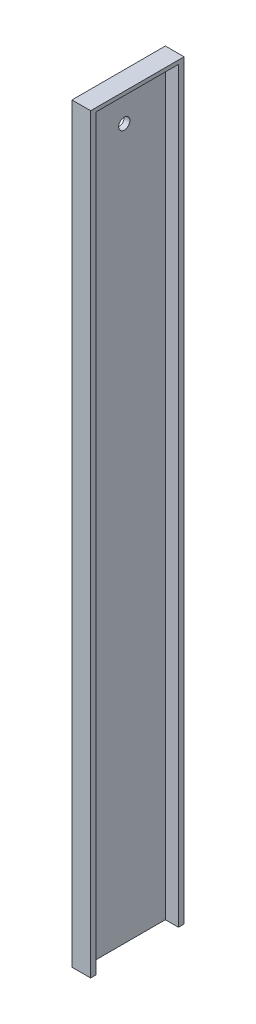
ISO-10303-21;
HEADER;
FILE_DESCRIPTION(('STEP AP214'),'2;1');
FILE_NAME('part.step','',(''),(''),'','','');
FILE_SCHEMA(('AUTOMOTIVE_DESIGN { 1 0 10303 214 1 1 1 1 }'));
ENDSEC;
DATA;
#1=APPLICATION_CONTEXT('core data for automotive mechanical design processes');
#2=APPLICATION_PROTOCOL_DEFINITION('international standard','automotive_design',2000,#1);
#3=PRODUCT_CONTEXT('',#1,'mechanical');
#4=PRODUCT('Part','Part','',(#3));
#5=PRODUCT_RELATED_PRODUCT_CATEGORY('part','',(#4));
#6=PRODUCT_DEFINITION_FORMATION('','',#4);
#7=PRODUCT_DEFINITION_CONTEXT('part definition',#1,'design');
#8=PRODUCT_DEFINITION('design','',#6,#7);
#9=PRODUCT_DEFINITION_SHAPE('','',#8);
#10=(LENGTH_UNIT() NAMED_UNIT(*) SI_UNIT(.MILLI.,.METRE.));
#11=(NAMED_UNIT(*) PLANE_ANGLE_UNIT() SI_UNIT($,.RADIAN.));
#12=(NAMED_UNIT(*) SI_UNIT($,.STERADIAN.) SOLID_ANGLE_UNIT());
#13=UNCERTAINTY_MEASURE_WITH_UNIT(LENGTH_MEASURE(1.E-05),#10,'distance_accuracy_value','');
#14=(GEOMETRIC_REPRESENTATION_CONTEXT(3) GLOBAL_UNCERTAINTY_ASSIGNED_CONTEXT((#13)) GLOBAL_UNIT_ASSIGNED_CONTEXT((#10,
#11,#12)) REPRESENTATION_CONTEXT('',''));
#15=CARTESIAN_POINT('',(0.,0.,0.));
#16=DIRECTION('',(0.,0.,1.));
#17=DIRECTION('',(1.,0.,0.));
#18=AXIS2_PLACEMENT_3D('',#15,#16,#17);
#19=CARTESIAN_POINT('',(-2.5,100.,12.5));
#20=DIRECTION('',(-1.,0.,0.));
#21=DIRECTION('',(0.,0.,1.));
#22=AXIS2_PLACEMENT_3D('',#19,#20,#21);
#23=PLANE('',#22);
#24=CARTESIAN_POINT('',(-2.5,90.,0.));
#25=DIRECTION('',(-1.,0.,0.));
#26=DIRECTION('',(0.,0.,1.));
#27=AXIS2_PLACEMENT_3D('',#24,#25,#26);
#28=CIRCLE('',#27,1.5);
#29=CARTESIAN_POINT('',(-2.5,90.,1.5));
#30=VERTEX_POINT('',#29);
#31=EDGE_CURVE('E205',#30,#30,#28,.T.);
#32=ORIENTED_EDGE('',*,*,#31,.F.);
#33=EDGE_LOOP('',(#32));
#34=FACE_BOUND('',#33,.T.);
#35=DIRECTION('',(0.,0.,-1.));
#36=VECTOR('',#35,1.);
#37=CARTESIAN_POINT('',(-2.5,-100.,12.5));
#38=LINE('',#37,#36);
#39=CARTESIAN_POINT('',(-2.5,-100.,12.5));
#40=VERTEX_POINT('',#39);
#41=CARTESIAN_POINT('',(-2.5,-100.,-12.5));
#42=VERTEX_POINT('',#41);
#43=EDGE_CURVE('E154',#40,#42,#38,.T.);
#44=ORIENTED_EDGE('',*,*,#43,.F.);
#45=DIRECTION('',(0.,-1.,0.));
#46=VECTOR('',#45,1.);
#47=CARTESIAN_POINT('',(-2.5,100.,12.5));
#48=LINE('',#47,#46);
#49=CARTESIAN_POINT('',(-2.5,101.,12.5));
#50=VERTEX_POINT('',#49);
#51=EDGE_CURVE('E11',#50,#40,#48,.T.);
#52=ORIENTED_EDGE('',*,*,#51,.F.);
#53=DIRECTION('',(0.,0.,-1.));
#54=VECTOR('',#53,1.);
#55=CARTESIAN_POINT('',(-2.5,101.,0.));
#56=LINE('',#55,#54);
#57=CARTESIAN_POINT('',(-2.5,101.,-12.5));
#58=VERTEX_POINT('',#57);
#59=EDGE_CURVE('E158',#50,#58,#56,.T.);
#60=ORIENTED_EDGE('',*,*,#59,.T.);
#61=DIRECTION('',(0.,-1.,0.));
#62=VECTOR('',#61,1.);
#63=CARTESIAN_POINT('',(-2.5,100.,-12.5));
#64=LINE('',#63,#62);
#65=EDGE_CURVE('E42',#58,#42,#64,.T.);
#66=ORIENTED_EDGE('',*,*,#65,.T.);
#67=EDGE_LOOP('',(#44,#52,#60,#66));
#68=FACE_BOUND('',#67,.T.);
#69=ADVANCED_FACE('F39',(#34,#68),#23,.T.);
#70=CARTESIAN_POINT('',(-2.5,100.,12.5));
#71=DIRECTION('',(0.,0.,-1.));
#72=DIRECTION('',(-1.,0.,0.));
#73=AXIS2_PLACEMENT_3D('',#70,#71,#72);
#74=PLANE('',#73);
#75=DIRECTION('',(1.,0.,0.));
#76=VECTOR('',#75,1.);
#77=CARTESIAN_POINT('',(-2.5,-100.,12.5));
#78=LINE('',#77,#76);
#79=CARTESIAN_POINT('',(2.5,-100.,12.5));
#80=VERTEX_POINT('',#79);
#81=EDGE_CURVE('E103',#40,#80,#78,.T.);
#82=ORIENTED_EDGE('',*,*,#81,.T.);
#83=DIRECTION('',(0.,-1.,0.));
#84=VECTOR('',#83,1.);
#85=CARTESIAN_POINT('',(2.5,100.,12.5));
#86=LINE('',#85,#84);
#87=CARTESIAN_POINT('',(2.5,101.,12.5));
#88=VERTEX_POINT('',#87);
#89=EDGE_CURVE('E49',#88,#80,#86,.T.);
#90=ORIENTED_EDGE('',*,*,#89,.F.);
#91=DIRECTION('',(1.,0.,0.));
#92=VECTOR('',#91,1.);
#93=CARTESIAN_POINT('',(0.,101.,12.5));
#94=LINE('',#93,#92);
#95=EDGE_CURVE('E194',#50,#88,#94,.T.);
#96=ORIENTED_EDGE('',*,*,#95,.F.);
#97=ORIENTED_EDGE('',*,*,#51,.T.);
#98=EDGE_LOOP('',(#82,#90,#96,#97));
#99=FACE_BOUND('',#98,.T.);
#100=ADVANCED_FACE('F104',(#99),#74,.F.);
#101=CARTESIAN_POINT('',(2.5,100.,11.));
#102=DIRECTION('',(1.,0.,0.));
#103=DIRECTION('',(0.,0.,-1.));
#104=AXIS2_PLACEMENT_3D('',#101,#102,#103);
#105=PLANE('',#104);
#106=DIRECTION('',(0.,0.,1.));
#107=VECTOR('',#106,1.);
#108=CARTESIAN_POINT('',(2.5,-100.,11.));
#109=LINE('',#108,#107);
#110=CARTESIAN_POINT('',(2.5,-100.,11.));
#111=VERTEX_POINT('',#110);
#112=EDGE_CURVE('E90',#111,#80,#109,.T.);
#113=ORIENTED_EDGE('',*,*,#112,.F.);
#114=DIRECTION('',(0.,-1.,0.));
#115=VECTOR('',#114,1.);
#116=CARTESIAN_POINT('',(2.5,100.,11.));
#117=LINE('',#116,#115);
#118=CARTESIAN_POINT('',(2.5,100.,11.));
#119=VERTEX_POINT('',#118);
#120=EDGE_CURVE('E100',#119,#111,#117,.T.);
#121=ORIENTED_EDGE('',*,*,#120,.F.);
#122=DIRECTION('',(0.,0.,1.));
#123=VECTOR('',#122,1.);
#124=CARTESIAN_POINT('',(2.5,100.,0.));
#125=LINE('',#124,#123);
#126=CARTESIAN_POINT('',(2.5,100.,-11.));
#127=VERTEX_POINT('',#126);
#128=EDGE_CURVE('E179',#127,#119,#125,.T.);
#129=ORIENTED_EDGE('',*,*,#128,.F.);
#130=DIRECTION('',(0.,-1.,0.));
#131=VECTOR('',#130,1.);
#132=CARTESIAN_POINT('',(2.5,100.,-11.));
#133=LINE('',#132,#131);
#134=CARTESIAN_POINT('',(2.5,-100.,-11.));
#135=VERTEX_POINT('',#134);
#136=EDGE_CURVE('E131',#127,#135,#133,.T.);
#137=ORIENTED_EDGE('',*,*,#136,.T.);
#138=DIRECTION('',(0.,0.,-1.));
#139=VECTOR('',#138,1.);
#140=CARTESIAN_POINT('',(2.5,-100.,-11.));
#141=LINE('',#140,#139);
#142=CARTESIAN_POINT('',(2.5,-100.,-12.5));
#143=VERTEX_POINT('',#142);
#144=EDGE_CURVE('E162',#135,#143,#141,.T.);
#145=ORIENTED_EDGE('',*,*,#144,.T.);
#146=DIRECTION('',(0.,-1.,0.));
#147=VECTOR('',#146,1.);
#148=CARTESIAN_POINT('',(2.5,100.,-12.5));
#149=LINE('',#148,#147);
#150=CARTESIAN_POINT('',(2.5,101.,-12.5));
#151=VERTEX_POINT('',#150);
#152=EDGE_CURVE('E133',#151,#143,#149,.T.);
#153=ORIENTED_EDGE('',*,*,#152,.F.);
#154=DIRECTION('',(0.,0.,1.));
#155=VECTOR('',#154,1.);
#156=CARTESIAN_POINT('',(2.5,101.,0.));
#157=LINE('',#156,#155);
#158=EDGE_CURVE('E95',#151,#88,#157,.T.);
#159=ORIENTED_EDGE('',*,*,#158,.T.);
#160=ORIENTED_EDGE('',*,*,#89,.T.);
#161=EDGE_LOOP('',(#113,#121,#129,#137,#145,#153,#159,#160));
#162=FACE_BOUND('',#161,.T.);
#163=ADVANCED_FACE('F87',(#162),#105,.T.);
#164=CARTESIAN_POINT('',(-1.,100.,11.));
#165=DIRECTION('',(0.,0.,-1.));
#166=DIRECTION('',(-1.,0.,0.));
#167=AXIS2_PLACEMENT_3D('',#164,#165,#166);
#168=PLANE('',#167);
#169=DIRECTION('',(1.,0.,0.));
#170=VECTOR('',#169,1.);
#171=CARTESIAN_POINT('',(-1.,-100.,11.));
#172=LINE('',#171,#170);
#173=CARTESIAN_POINT('',(-1.,-100.,11.));
#174=VERTEX_POINT('',#173);
#175=EDGE_CURVE('E115',#174,#111,#172,.T.);
#176=ORIENTED_EDGE('',*,*,#175,.F.);
#177=DIRECTION('',(0.,-1.,0.));
#178=VECTOR('',#177,1.);
#179=CARTESIAN_POINT('',(-1.,100.,11.));
#180=LINE('',#179,#178);
#181=CARTESIAN_POINT('',(-1.,100.,11.));
#182=VERTEX_POINT('',#181);
#183=EDGE_CURVE('E125',#182,#174,#180,.T.);
#184=ORIENTED_EDGE('',*,*,#183,.F.);
#185=DIRECTION('',(1.,0.,0.));
#186=VECTOR('',#185,1.);
#187=CARTESIAN_POINT('',(-1.,100.,11.));
#188=LINE('',#187,#186);
#189=EDGE_CURVE('E140',#182,#119,#188,.T.);
#190=ORIENTED_EDGE('',*,*,#189,.T.);
#191=ORIENTED_EDGE('',*,*,#120,.T.);
#192=EDGE_LOOP('',(#176,#184,#190,#191));
#193=FACE_BOUND('',#192,.T.);
#194=ADVANCED_FACE('F175',(#193),#168,.T.);
#195=CARTESIAN_POINT('',(-1.,100.,-11.));
#196=DIRECTION('',(1.,0.,0.));
#197=DIRECTION('',(0.,0.,-1.));
#198=AXIS2_PLACEMENT_3D('',#195,#196,#197);
#199=PLANE('',#198);
#200=CARTESIAN_POINT('',(-1.,90.,0.));
#201=DIRECTION('',(1.,0.,0.));
#202=DIRECTION('',(0.,0.,-1.));
#203=AXIS2_PLACEMENT_3D('',#200,#201,#202);
#204=CIRCLE('',#203,1.5);
#205=CARTESIAN_POINT('',(-1.,90.,-1.5));
#206=VERTEX_POINT('',#205);
#207=EDGE_CURVE('E231',#206,#206,#204,.T.);
#208=ORIENTED_EDGE('',*,*,#207,.F.);
#209=EDGE_LOOP('',(#208));
#210=FACE_BOUND('',#209,.T.);
#211=DIRECTION('',(0.,0.,1.));
#212=VECTOR('',#211,1.);
#213=CARTESIAN_POINT('',(-1.,-100.,-11.));
#214=LINE('',#213,#212);
#215=CARTESIAN_POINT('',(-1.,-100.,-11.));
#216=VERTEX_POINT('',#215);
#217=EDGE_CURVE('E119',#216,#174,#214,.T.);
#218=ORIENTED_EDGE('',*,*,#217,.F.);
#219=DIRECTION('',(0.,-1.,0.));
#220=VECTOR('',#219,1.);
#221=CARTESIAN_POINT('',(-1.,100.,-11.));
#222=LINE('',#221,#220);
#223=CARTESIAN_POINT('',(-1.,100.,-11.));
#224=VERTEX_POINT('',#223);
#225=EDGE_CURVE('E128',#224,#216,#222,.T.);
#226=ORIENTED_EDGE('',*,*,#225,.F.);
#227=DIRECTION('',(0.,0.,1.));
#228=VECTOR('',#227,1.);
#229=CARTESIAN_POINT('',(-1.,100.,-11.));
#230=LINE('',#229,#228);
#231=EDGE_CURVE('E57',#224,#182,#230,.T.);
#232=ORIENTED_EDGE('',*,*,#231,.T.);
#233=ORIENTED_EDGE('',*,*,#183,.T.);
#234=EDGE_LOOP('',(#218,#226,#232,#233));
#235=FACE_BOUND('',#234,.T.);
#236=ADVANCED_FACE('F173',(#210,#235),#199,.T.);
#237=CARTESIAN_POINT('',(2.5,100.,-11.));
#238=DIRECTION('',(0.,0.,1.));
#239=DIRECTION('',(1.,0.,0.));
#240=AXIS2_PLACEMENT_3D('',#237,#238,#239);
#241=PLANE('',#240);
#242=DIRECTION('',(-1.,0.,0.));
#243=VECTOR('',#242,1.);
#244=CARTESIAN_POINT('',(2.5,-100.,-11.));
#245=LINE('',#244,#243);
#246=EDGE_CURVE('E165',#135,#216,#245,.T.);
#247=ORIENTED_EDGE('',*,*,#246,.F.);
#248=ORIENTED_EDGE('',*,*,#136,.F.);
#249=DIRECTION('',(-1.,0.,0.));
#250=VECTOR('',#249,1.);
#251=CARTESIAN_POINT('',(2.5,100.,-11.));
#252=LINE('',#251,#250);
#253=EDGE_CURVE('E110',#127,#224,#252,.T.);
#254=ORIENTED_EDGE('',*,*,#253,.T.);
#255=ORIENTED_EDGE('',*,*,#225,.T.);
#256=EDGE_LOOP('',(#247,#248,#254,#255));
#257=FACE_BOUND('',#256,.T.);
#258=ADVANCED_FACE('F208',(#257),#241,.T.);
#259=CARTESIAN_POINT('',(-2.5,100.,-12.5));
#260=DIRECTION('',(0.,0.,-1.));
#261=DIRECTION('',(-1.,0.,0.));
#262=AXIS2_PLACEMENT_3D('',#259,#260,#261);
#263=PLANE('',#262);
#264=DIRECTION('',(1.,0.,0.));
#265=VECTOR('',#264,1.);
#266=CARTESIAN_POINT('',(-2.5,-100.,-12.5));
#267=LINE('',#266,#265);
#268=EDGE_CURVE('E157',#42,#143,#267,.T.);
#269=ORIENTED_EDGE('',*,*,#268,.F.);
#270=ORIENTED_EDGE('',*,*,#65,.F.);
#271=DIRECTION('',(1.,0.,0.));
#272=VECTOR('',#271,1.);
#273=CARTESIAN_POINT('',(0.,101.,-12.5));
#274=LINE('',#273,#272);
#275=EDGE_CURVE('E193',#58,#151,#274,.T.);
#276=ORIENTED_EDGE('',*,*,#275,.T.);
#277=ORIENTED_EDGE('',*,*,#152,.T.);
#278=EDGE_LOOP('',(#269,#270,#276,#277));
#279=FACE_BOUND('',#278,.T.);
#280=ADVANCED_FACE('F197',(#279),#263,.T.);
#281=CARTESIAN_POINT('',(0.,-100.,0.));
#282=DIRECTION('',(0.,-1.,0.));
#283=DIRECTION('',(0.,0.,-1.));
#284=AXIS2_PLACEMENT_3D('',#281,#282,#283);
#285=PLANE('',#284);
#286=ORIENTED_EDGE('',*,*,#43,.T.);
#287=ORIENTED_EDGE('',*,*,#268,.T.);
#288=ORIENTED_EDGE('',*,*,#144,.F.);
#289=ORIENTED_EDGE('',*,*,#246,.T.);
#290=ORIENTED_EDGE('',*,*,#217,.T.);
#291=ORIENTED_EDGE('',*,*,#175,.T.);
#292=ORIENTED_EDGE('',*,*,#112,.T.);
#293=ORIENTED_EDGE('',*,*,#81,.F.);
#294=EDGE_LOOP('',(#286,#287,#288,#289,#290,#291,#292,#293));
#295=FACE_BOUND('',#294,.T.);
#296=ADVANCED_FACE('F112',(#295),#285,.T.);
#297=CARTESIAN_POINT('',(0.,100.,0.));
#298=DIRECTION('',(0.,-1.,0.));
#299=DIRECTION('',(0.,0.,-1.));
#300=AXIS2_PLACEMENT_3D('',#297,#298,#299);
#301=PLANE('',#300);
#302=ORIENTED_EDGE('',*,*,#189,.F.);
#303=ORIENTED_EDGE('',*,*,#231,.F.);
#304=ORIENTED_EDGE('',*,*,#253,.F.);
#305=ORIENTED_EDGE('',*,*,#128,.T.);
#306=EDGE_LOOP('',(#302,#303,#304,#305));
#307=FACE_BOUND('',#306,.T.);
#308=ADVANCED_FACE('F209',(#307),#301,.T.);
#309=CARTESIAN_POINT('',(0.,101.,0.));
#310=DIRECTION('',(0.,-1.,0.));
#311=DIRECTION('',(0.,0.,-1.));
#312=AXIS2_PLACEMENT_3D('',#309,#310,#311);
#313=PLANE('',#312);
#314=ORIENTED_EDGE('',*,*,#95,.T.);
#315=ORIENTED_EDGE('',*,*,#158,.F.);
#316=ORIENTED_EDGE('',*,*,#275,.F.);
#317=ORIENTED_EDGE('',*,*,#59,.F.);
#318=EDGE_LOOP('',(#314,#315,#316,#317));
#319=FACE_BOUND('',#318,.T.);
#320=ADVANCED_FACE('F191',(#319),#313,.F.);
#321=CARTESIAN_POINT('',(-26.,90.,0.));
#322=DIRECTION('',(1.,0.,0.));
#323=DIRECTION('',(0.,0.,-1.));
#324=AXIS2_PLACEMENT_3D('',#321,#322,#323);
#325=CYLINDRICAL_SURFACE('',#324,1.5);
#326=ORIENTED_EDGE('',*,*,#31,.T.);
#327=EDGE_LOOP('',(#326));
#328=FACE_BOUND('',#327,.T.);
#329=ORIENTED_EDGE('',*,*,#207,.T.);
#330=EDGE_LOOP('',(#329));
#331=FACE_BOUND('',#330,.T.);
#332=ADVANCED_FACE('F216',(#328,#331),#325,.F.);
#333=CLOSED_SHELL('',(#69,#100,#163,#194,#236,#258,#280,#296,#308,#320,#332));
#334=MANIFOLD_SOLID_BREP('B2',#333);
#335=ADVANCED_BREP_SHAPE_REPRESENTATION('',(#18,#334),#14);
#336=SHAPE_DEFINITION_REPRESENTATION(#9,#335);
ENDSEC;
END-ISO-10303-21;
